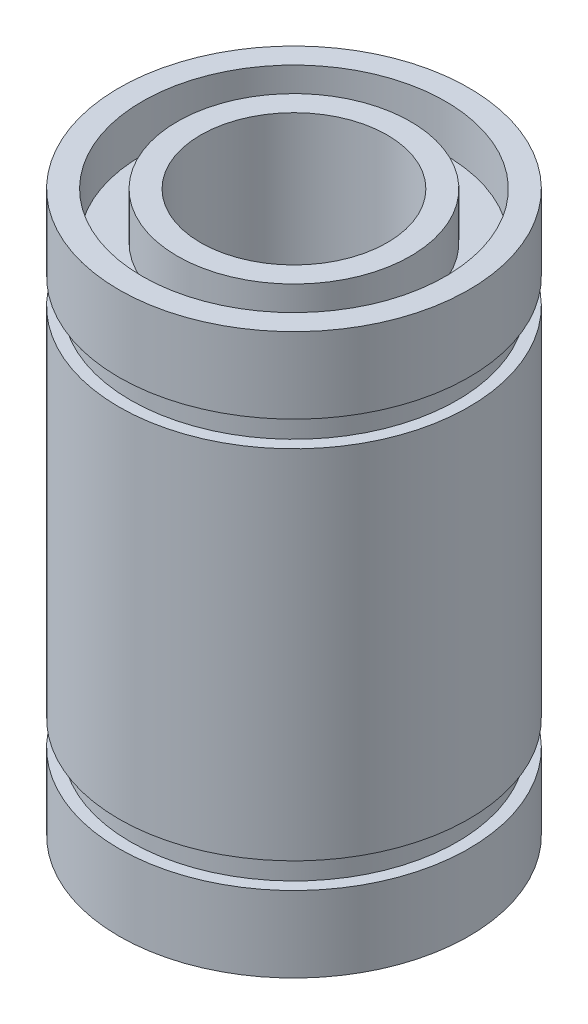
ISO-10303-21;
HEADER;
FILE_DESCRIPTION(('STEP AP214'),'2;1');
FILE_NAME('part.step','',(''),(''),'','','');
FILE_SCHEMA(('AUTOMOTIVE_DESIGN { 1 0 10303 214 1 1 1 1 }'));
ENDSEC;
DATA;
#1=APPLICATION_CONTEXT('core data for automotive mechanical design processes');
#2=APPLICATION_PROTOCOL_DEFINITION('international standard','automotive_design',2000,#1);
#3=PRODUCT_CONTEXT('',#1,'mechanical');
#4=PRODUCT('Part','Part','',(#3));
#5=PRODUCT_RELATED_PRODUCT_CATEGORY('part','',(#4));
#6=PRODUCT_DEFINITION_FORMATION('','',#4);
#7=PRODUCT_DEFINITION_CONTEXT('part definition',#1,'design');
#8=PRODUCT_DEFINITION('design','',#6,#7);
#9=PRODUCT_DEFINITION_SHAPE('','',#8);
#10=(LENGTH_UNIT() NAMED_UNIT(*) SI_UNIT(.MILLI.,.METRE.));
#11=(NAMED_UNIT(*) PLANE_ANGLE_UNIT() SI_UNIT($,.RADIAN.));
#12=(NAMED_UNIT(*) SI_UNIT($,.STERADIAN.) SOLID_ANGLE_UNIT());
#13=UNCERTAINTY_MEASURE_WITH_UNIT(LENGTH_MEASURE(1.E-05),#10,'distance_accuracy_value','');
#14=(GEOMETRIC_REPRESENTATION_CONTEXT(3) GLOBAL_UNCERTAINTY_ASSIGNED_CONTEXT((#13)) GLOBAL_UNIT_ASSIGNED_CONTEXT((#10,
#11,#12)) REPRESENTATION_CONTEXT('',''));
#15=CARTESIAN_POINT('',(0.,0.,0.));
#16=DIRECTION('',(0.,0.,1.));
#17=DIRECTION('',(1.,0.,0.));
#18=AXIS2_PLACEMENT_3D('',#15,#16,#17);
#19=CARTESIAN_POINT('',(0.,12000.,0.));
#20=DIRECTION('',(0.,-1.,0.));
#21=DIRECTION('',(0.,0.,-1.));
#22=AXIS2_PLACEMENT_3D('',#19,#20,#21);
#23=CYLINDRICAL_SURFACE('',#22,7500.);
#24=CARTESIAN_POINT('',(0.,-12000.,0.));
#25=DIRECTION('',(0.,1.,0.));
#26=DIRECTION('',(0.,0.,1.));
#27=AXIS2_PLACEMENT_3D('',#24,#25,#26);
#28=CIRCLE('',#27,7500.);
#29=CARTESIAN_POINT('',(0.,-12000.,7500.));
#30=VERTEX_POINT('',#29);
#31=EDGE_CURVE('E49',#30,#30,#28,.T.);
#32=ORIENTED_EDGE('',*,*,#31,.T.);
#33=EDGE_LOOP('',(#32));
#34=FACE_BOUND('',#33,.T.);
#35=CARTESIAN_POINT('',(0.,-8750.,0.));
#36=DIRECTION('',(0.,1.,0.));
#37=DIRECTION('',(0.,0.,1.));
#38=AXIS2_PLACEMENT_3D('',#35,#36,#37);
#39=CIRCLE('',#38,7500.);
#40=CARTESIAN_POINT('',(0.,-8750.,7500.));
#41=VERTEX_POINT('',#40);
#42=EDGE_CURVE('E186',#41,#41,#39,.T.);
#43=ORIENTED_EDGE('',*,*,#42,.F.);
#44=EDGE_LOOP('',(#43));
#45=FACE_BOUND('',#44,.T.);
#46=ADVANCED_FACE('F33',(#34,#45),#23,.T.);
#47=CARTESIAN_POINT('',(0.,-7650.,0.));
#48=DIRECTION('',(0.,1.,0.));
#49=DIRECTION('',(0.,0.,1.));
#50=AXIS2_PLACEMENT_3D('',#47,#48,#49);
#51=CIRCLE('',#50,7500.);
#52=CARTESIAN_POINT('',(0.,-7650.,7500.));
#53=VERTEX_POINT('',#52);
#54=EDGE_CURVE('E183',#53,#53,#51,.T.);
#55=ORIENTED_EDGE('',*,*,#54,.T.);
#56=EDGE_LOOP('',(#55));
#57=FACE_BOUND('',#56,.T.);
#58=CARTESIAN_POINT('',(0.,7650.,0.));
#59=DIRECTION('',(0.,1.,0.));
#60=DIRECTION('',(0.,0.,1.));
#61=AXIS2_PLACEMENT_3D('',#58,#59,#60);
#62=CIRCLE('',#61,7500.);
#63=CARTESIAN_POINT('',(0.,7650.,7500.));
#64=VERTEX_POINT('',#63);
#65=EDGE_CURVE('E96',#64,#64,#62,.T.);
#66=ORIENTED_EDGE('',*,*,#65,.F.);
#67=EDGE_LOOP('',(#66));
#68=FACE_BOUND('',#67,.T.);
#69=ADVANCED_FACE('F78',(#57,#68),#23,.T.);
#70=CARTESIAN_POINT('',(0.,12000.,0.));
#71=DIRECTION('',(0.,-1.,0.));
#72=DIRECTION('',(0.,0.,-1.));
#73=AXIS2_PLACEMENT_3D('',#70,#71,#72);
#74=CYLINDRICAL_SURFACE('',#73,6500.);
#75=CARTESIAN_POINT('',(0.,-12000.,0.));
#76=DIRECTION('',(0.,1.,0.));
#77=DIRECTION('',(0.,0.,1.));
#78=AXIS2_PLACEMENT_3D('',#75,#76,#77);
#79=CIRCLE('',#78,6500.);
#80=CARTESIAN_POINT('',(0.,-12000.,6500.));
#81=VERTEX_POINT('',#80);
#82=EDGE_CURVE('E53',#81,#81,#79,.T.);
#83=ORIENTED_EDGE('',*,*,#82,.F.);
#84=EDGE_LOOP('',(#83));
#85=FACE_BOUND('',#84,.T.);
#86=CARTESIAN_POINT('',(0.,-10000.,0.));
#87=DIRECTION('',(0.,1.,0.));
#88=DIRECTION('',(0.,0.,1.));
#89=AXIS2_PLACEMENT_3D('',#86,#87,#88);
#90=CIRCLE('',#89,6500.);
#91=CARTESIAN_POINT('',(0.,-10000.,6500.));
#92=VERTEX_POINT('',#91);
#93=EDGE_CURVE('E119',#92,#92,#90,.T.);
#94=ORIENTED_EDGE('',*,*,#93,.T.);
#95=EDGE_LOOP('',(#94));
#96=FACE_BOUND('',#95,.T.);
#97=ADVANCED_FACE('F82',(#85,#96),#74,.F.);
#98=CARTESIAN_POINT('',(0.,10000.,0.));
#99=DIRECTION('',(0.,1.,0.));
#100=DIRECTION('',(0.,0.,1.));
#101=AXIS2_PLACEMENT_3D('',#98,#99,#100);
#102=CIRCLE('',#101,6500.);
#103=CARTESIAN_POINT('',(0.,10000.,6500.));
#104=VERTEX_POINT('',#103);
#105=EDGE_CURVE('E10',#104,#104,#102,.T.);
#106=ORIENTED_EDGE('',*,*,#105,.F.);
#107=EDGE_LOOP('',(#106));
#108=FACE_BOUND('',#107,.T.);
#109=CARTESIAN_POINT('',(0.,12000.,0.));
#110=DIRECTION('',(0.,1.,0.));
#111=DIRECTION('',(0.,0.,1.));
#112=AXIS2_PLACEMENT_3D('',#109,#110,#111);
#113=CIRCLE('',#112,6500.);
#114=CARTESIAN_POINT('',(0.,12000.,6500.));
#115=VERTEX_POINT('',#114);
#116=EDGE_CURVE('E44',#115,#115,#113,.T.);
#117=ORIENTED_EDGE('',*,*,#116,.T.);
#118=EDGE_LOOP('',(#117));
#119=FACE_BOUND('',#118,.T.);
#120=ADVANCED_FACE('F35',(#108,#119),#74,.F.);
#121=CARTESIAN_POINT('',(0.,8750.,0.));
#122=DIRECTION('',(0.,1.,0.));
#123=DIRECTION('',(0.,0.,1.));
#124=AXIS2_PLACEMENT_3D('',#121,#122,#123);
#125=CIRCLE('',#124,7500.);
#126=CARTESIAN_POINT('',(0.,8750.,7500.));
#127=VERTEX_POINT('',#126);
#128=EDGE_CURVE('E93',#127,#127,#125,.T.);
#129=ORIENTED_EDGE('',*,*,#128,.T.);
#130=EDGE_LOOP('',(#129));
#131=FACE_BOUND('',#130,.T.);
#132=CARTESIAN_POINT('',(0.,12000.,0.));
#133=DIRECTION('',(0.,1.,0.));
#134=DIRECTION('',(0.,0.,1.));
#135=AXIS2_PLACEMENT_3D('',#132,#133,#134);
#136=CIRCLE('',#135,7500.);
#137=CARTESIAN_POINT('',(0.,12000.,7500.));
#138=VERTEX_POINT('',#137);
#139=EDGE_CURVE('E40',#138,#138,#136,.T.);
#140=ORIENTED_EDGE('',*,*,#139,.F.);
#141=EDGE_LOOP('',(#140));
#142=FACE_BOUND('',#141,.T.);
#143=ADVANCED_FACE('F74',(#131,#142),#23,.T.);
#144=CARTESIAN_POINT('',(0.,12000.,0.));
#145=DIRECTION('',(0.,1.,0.));
#146=DIRECTION('',(0.,0.,1.));
#147=AXIS2_PLACEMENT_3D('',#144,#145,#146);
#148=PLANE('',#147);
#149=ORIENTED_EDGE('',*,*,#116,.F.);
#150=EDGE_LOOP('',(#149));
#151=FACE_BOUND('',#150,.T.);
#152=ORIENTED_EDGE('',*,*,#139,.T.);
#153=EDGE_LOOP('',(#152));
#154=FACE_BOUND('',#153,.T.);
#155=ADVANCED_FACE('F64',(#151,#154),#148,.T.);
#156=CARTESIAN_POINT('',(0.,-12000.,0.));
#157=DIRECTION('',(0.,1.,0.));
#158=DIRECTION('',(0.,0.,1.));
#159=AXIS2_PLACEMENT_3D('',#156,#157,#158);
#160=PLANE('',#159);
#161=ORIENTED_EDGE('',*,*,#82,.T.);
#162=EDGE_LOOP('',(#161));
#163=FACE_BOUND('',#162,.T.);
#164=ORIENTED_EDGE('',*,*,#31,.F.);
#165=EDGE_LOOP('',(#164));
#166=FACE_BOUND('',#165,.T.);
#167=ADVANCED_FACE('F61',(#163,#166),#160,.F.);
#168=CARTESIAN_POINT('',(0.,10000.,0.));
#169=DIRECTION('',(0.,1.,0.));
#170=DIRECTION('',(0.,0.,1.));
#171=AXIS2_PLACEMENT_3D('',#168,#169,#170);
#172=PLANE('',#171);
#173=CARTESIAN_POINT('',(0.,10000.,0.));
#174=DIRECTION('',(0.,1.,0.));
#175=DIRECTION('',(0.,0.,1.));
#176=AXIS2_PLACEMENT_3D('',#173,#174,#175);
#177=CIRCLE('',#176,5000.);
#178=CARTESIAN_POINT('',(0.,10000.,5000.));
#179=VERTEX_POINT('',#178);
#180=EDGE_CURVE('E55',#179,#179,#177,.T.);
#181=ORIENTED_EDGE('',*,*,#180,.F.);
#182=EDGE_LOOP('',(#181));
#183=FACE_BOUND('',#182,.T.);
#184=ORIENTED_EDGE('',*,*,#105,.T.);
#185=EDGE_LOOP('',(#184));
#186=FACE_BOUND('',#185,.T.);
#187=ADVANCED_FACE('F63',(#183,#186),#172,.T.);
#188=CARTESIAN_POINT('',(0.,-10000.,0.));
#189=DIRECTION('',(0.,1.,0.));
#190=DIRECTION('',(0.,0.,1.));
#191=AXIS2_PLACEMENT_3D('',#188,#189,#190);
#192=PLANE('',#191);
#193=CARTESIAN_POINT('',(0.,-10000.,0.));
#194=DIRECTION('',(0.,1.,0.));
#195=DIRECTION('',(0.,0.,1.));
#196=AXIS2_PLACEMENT_3D('',#193,#194,#195);
#197=CIRCLE('',#196,5000.);
#198=CARTESIAN_POINT('',(0.,-10000.,5000.));
#199=VERTEX_POINT('',#198);
#200=EDGE_CURVE('E113',#199,#199,#197,.F.);
#201=ORIENTED_EDGE('',*,*,#200,.F.);
#202=EDGE_LOOP('',(#201));
#203=FACE_BOUND('',#202,.T.);
#204=ORIENTED_EDGE('',*,*,#93,.F.);
#205=EDGE_LOOP('',(#204));
#206=FACE_BOUND('',#205,.T.);
#207=ADVANCED_FACE('F71',(#203,#206),#192,.F.);
#208=CARTESIAN_POINT('',(0.,12000.,0.));
#209=DIRECTION('',(0.,-1.,0.));
#210=DIRECTION('',(0.,0.,-1.));
#211=AXIS2_PLACEMENT_3D('',#208,#209,#210);
#212=CYLINDRICAL_SURFACE('',#211,5000.);
#213=CARTESIAN_POINT('',(0.,-12000.,0.));
#214=DIRECTION('',(0.,1.,0.));
#215=DIRECTION('',(0.,0.,1.));
#216=AXIS2_PLACEMENT_3D('',#213,#214,#215);
#217=CIRCLE('',#216,5000.);
#218=CARTESIAN_POINT('',(0.,-12000.,5000.));
#219=VERTEX_POINT('',#218);
#220=EDGE_CURVE('E99',#219,#219,#217,.T.);
#221=ORIENTED_EDGE('',*,*,#220,.T.);
#222=EDGE_LOOP('',(#221));
#223=FACE_BOUND('',#222,.T.);
#224=ORIENTED_EDGE('',*,*,#200,.T.);
#225=EDGE_LOOP('',(#224));
#226=FACE_BOUND('',#225,.T.);
#227=ADVANCED_FACE('F126',(#223,#226),#212,.T.);
#228=CARTESIAN_POINT('',(0.,12000.,0.));
#229=DIRECTION('',(0.,-1.,0.));
#230=DIRECTION('',(0.,0.,-1.));
#231=AXIS2_PLACEMENT_3D('',#228,#229,#230);
#232=CYLINDRICAL_SURFACE('',#231,4000.);
#233=CARTESIAN_POINT('',(0.,12000.,0.));
#234=DIRECTION('',(0.,1.,0.));
#235=DIRECTION('',(0.,0.,1.));
#236=AXIS2_PLACEMENT_3D('',#233,#234,#235);
#237=CIRCLE('',#236,4000.);
#238=CARTESIAN_POINT('',(0.,12000.,4000.));
#239=VERTEX_POINT('',#238);
#240=EDGE_CURVE('E108',#239,#239,#237,.T.);
#241=ORIENTED_EDGE('',*,*,#240,.T.);
#242=EDGE_LOOP('',(#241));
#243=FACE_BOUND('',#242,.T.);
#244=CARTESIAN_POINT('',(0.,-12000.,0.));
#245=DIRECTION('',(0.,1.,0.));
#246=DIRECTION('',(0.,0.,1.));
#247=AXIS2_PLACEMENT_3D('',#244,#245,#246);
#248=CIRCLE('',#247,4000.);
#249=CARTESIAN_POINT('',(0.,-12000.,4000.));
#250=VERTEX_POINT('',#249);
#251=EDGE_CURVE('E95',#250,#250,#248,.T.);
#252=ORIENTED_EDGE('',*,*,#251,.F.);
#253=EDGE_LOOP('',(#252));
#254=FACE_BOUND('',#253,.T.);
#255=ADVANCED_FACE('F132',(#243,#254),#232,.F.);
#256=ORIENTED_EDGE('',*,*,#180,.T.);
#257=EDGE_LOOP('',(#256));
#258=FACE_BOUND('',#257,.T.);
#259=CARTESIAN_POINT('',(0.,12000.,0.));
#260=DIRECTION('',(0.,1.,0.));
#261=DIRECTION('',(0.,0.,1.));
#262=AXIS2_PLACEMENT_3D('',#259,#260,#261);
#263=CIRCLE('',#262,5000.);
#264=CARTESIAN_POINT('',(0.,12000.,5000.));
#265=VERTEX_POINT('',#264);
#266=EDGE_CURVE('E111',#265,#265,#263,.T.);
#267=ORIENTED_EDGE('',*,*,#266,.F.);
#268=EDGE_LOOP('',(#267));
#269=FACE_BOUND('',#268,.T.);
#270=ADVANCED_FACE('F135',(#258,#269),#212,.T.);
#271=CARTESIAN_POINT('',(0.,12000.,0.));
#272=DIRECTION('',(0.,1.,0.));
#273=DIRECTION('',(0.,0.,1.));
#274=AXIS2_PLACEMENT_3D('',#271,#272,#273);
#275=PLANE('',#274);
#276=ORIENTED_EDGE('',*,*,#240,.F.);
#277=EDGE_LOOP('',(#276));
#278=FACE_BOUND('',#277,.T.);
#279=ORIENTED_EDGE('',*,*,#266,.T.);
#280=EDGE_LOOP('',(#279));
#281=FACE_BOUND('',#280,.T.);
#282=ADVANCED_FACE('F142',(#278,#281),#275,.T.);
#283=CARTESIAN_POINT('',(0.,-12000.,0.));
#284=DIRECTION('',(0.,1.,0.));
#285=DIRECTION('',(0.,0.,1.));
#286=AXIS2_PLACEMENT_3D('',#283,#284,#285);
#287=PLANE('',#286);
#288=ORIENTED_EDGE('',*,*,#251,.T.);
#289=EDGE_LOOP('',(#288));
#290=FACE_BOUND('',#289,.T.);
#291=ORIENTED_EDGE('',*,*,#220,.F.);
#292=EDGE_LOOP('',(#291));
#293=FACE_BOUND('',#292,.T.);
#294=ADVANCED_FACE('F144',(#290,#293),#287,.F.);
#295=CARTESIAN_POINT('',(0.,8750.,0.));
#296=DIRECTION('',(0.,1.,0.));
#297=DIRECTION('',(0.,0.,1.));
#298=AXIS2_PLACEMENT_3D('',#295,#296,#297);
#299=PLANE('',#298);
#300=ORIENTED_EDGE('',*,*,#128,.F.);
#301=EDGE_LOOP('',(#300));
#302=FACE_BOUND('',#301,.T.);
#303=CARTESIAN_POINT('',(0.,8750.,0.));
#304=DIRECTION('',(0.,1.,0.));
#305=DIRECTION('',(0.,0.,1.));
#306=AXIS2_PLACEMENT_3D('',#303,#304,#305);
#307=CIRCLE('',#306,7000.);
#308=CARTESIAN_POINT('',(0.,8750.,7000.));
#309=VERTEX_POINT('',#308);
#310=EDGE_CURVE('E102',#309,#309,#307,.T.);
#311=ORIENTED_EDGE('',*,*,#310,.T.);
#312=EDGE_LOOP('',(#311));
#313=FACE_BOUND('',#312,.T.);
#314=ADVANCED_FACE('F147',(#302,#313),#299,.F.);
#315=CARTESIAN_POINT('',(0.,7650.,0.));
#316=DIRECTION('',(0.,1.,0.));
#317=DIRECTION('',(0.,0.,1.));
#318=AXIS2_PLACEMENT_3D('',#315,#316,#317);
#319=PLANE('',#318);
#320=ORIENTED_EDGE('',*,*,#65,.T.);
#321=EDGE_LOOP('',(#320));
#322=FACE_BOUND('',#321,.T.);
#323=CARTESIAN_POINT('',(0.,7650.,0.));
#324=DIRECTION('',(0.,1.,0.));
#325=DIRECTION('',(0.,0.,1.));
#326=AXIS2_PLACEMENT_3D('',#323,#324,#325);
#327=CIRCLE('',#326,7000.);
#328=CARTESIAN_POINT('',(0.,7650.,7000.));
#329=VERTEX_POINT('',#328);
#330=EDGE_CURVE('E105',#329,#329,#327,.T.);
#331=ORIENTED_EDGE('',*,*,#330,.F.);
#332=EDGE_LOOP('',(#331));
#333=FACE_BOUND('',#332,.T.);
#334=ADVANCED_FACE('F152',(#322,#333),#319,.T.);
#335=CARTESIAN_POINT('',(0.,8750.,0.));
#336=DIRECTION('',(0.,-1.,0.));
#337=DIRECTION('',(0.,0.,-1.));
#338=AXIS2_PLACEMENT_3D('',#335,#336,#337);
#339=CYLINDRICAL_SURFACE('',#338,7000.);
#340=ORIENTED_EDGE('',*,*,#310,.F.);
#341=EDGE_LOOP('',(#340));
#342=FACE_BOUND('',#341,.T.);
#343=ORIENTED_EDGE('',*,*,#330,.T.);
#344=EDGE_LOOP('',(#343));
#345=FACE_BOUND('',#344,.T.);
#346=ADVANCED_FACE('F155',(#342,#345),#339,.T.);
#347=CARTESIAN_POINT('',(0.,-8750.,0.));
#348=DIRECTION('',(0.,1.,0.));
#349=DIRECTION('',(0.,0.,1.));
#350=AXIS2_PLACEMENT_3D('',#347,#348,#349);
#351=PLANE('',#350);
#352=CARTESIAN_POINT('',(0.,-8750.,0.));
#353=DIRECTION('',(0.,1.,0.));
#354=DIRECTION('',(0.,0.,1.));
#355=AXIS2_PLACEMENT_3D('',#352,#353,#354);
#356=CIRCLE('',#355,7000.);
#357=CARTESIAN_POINT('',(0.,-8750.,7000.));
#358=VERTEX_POINT('',#357);
#359=EDGE_CURVE('E178',#358,#358,#356,.T.);
#360=ORIENTED_EDGE('',*,*,#359,.F.);
#361=EDGE_LOOP('',(#360));
#362=FACE_BOUND('',#361,.T.);
#363=ORIENTED_EDGE('',*,*,#42,.T.);
#364=EDGE_LOOP('',(#363));
#365=FACE_BOUND('',#364,.T.);
#366=ADVANCED_FACE('F161',(#362,#365),#351,.T.);
#367=CARTESIAN_POINT('',(0.,-7650.,0.));
#368=DIRECTION('',(0.,1.,0.));
#369=DIRECTION('',(0.,0.,1.));
#370=AXIS2_PLACEMENT_3D('',#367,#368,#369);
#371=PLANE('',#370);
#372=CARTESIAN_POINT('',(0.,-7650.,0.));
#373=DIRECTION('',(0.,1.,0.));
#374=DIRECTION('',(0.,0.,1.));
#375=AXIS2_PLACEMENT_3D('',#372,#373,#374);
#376=CIRCLE('',#375,7000.);
#377=CARTESIAN_POINT('',(0.,-7650.,7000.));
#378=VERTEX_POINT('',#377);
#379=EDGE_CURVE('E181',#378,#378,#376,.T.);
#380=ORIENTED_EDGE('',*,*,#379,.T.);
#381=EDGE_LOOP('',(#380));
#382=FACE_BOUND('',#381,.T.);
#383=ORIENTED_EDGE('',*,*,#54,.F.);
#384=EDGE_LOOP('',(#383));
#385=FACE_BOUND('',#384,.T.);
#386=ADVANCED_FACE('F163',(#382,#385),#371,.F.);
#387=CARTESIAN_POINT('',(0.,-8750.,0.));
#388=DIRECTION('',(0.,1.,0.));
#389=DIRECTION('',(0.,0.,1.));
#390=AXIS2_PLACEMENT_3D('',#387,#388,#389);
#391=CYLINDRICAL_SURFACE('',#390,7000.);
#392=ORIENTED_EDGE('',*,*,#359,.T.);
#393=EDGE_LOOP('',(#392));
#394=FACE_BOUND('',#393,.T.);
#395=ORIENTED_EDGE('',*,*,#379,.F.);
#396=EDGE_LOOP('',(#395));
#397=FACE_BOUND('',#396,.T.);
#398=ADVANCED_FACE('F166',(#394,#397),#391,.T.);
#399=CLOSED_SHELL('',(#46,#69,#97,#120,#143,#155,#167,#187,#207,#227,#255,#270,#282,#294,#314,
#334,#346,#366,#386,#398));
#400=MANIFOLD_SOLID_BREP('B2',#399);
#401=ADVANCED_BREP_SHAPE_REPRESENTATION('',(#18,#400),#14);
#402=SHAPE_DEFINITION_REPRESENTATION(#9,#401);
ENDSEC;
END-ISO-10303-21;
